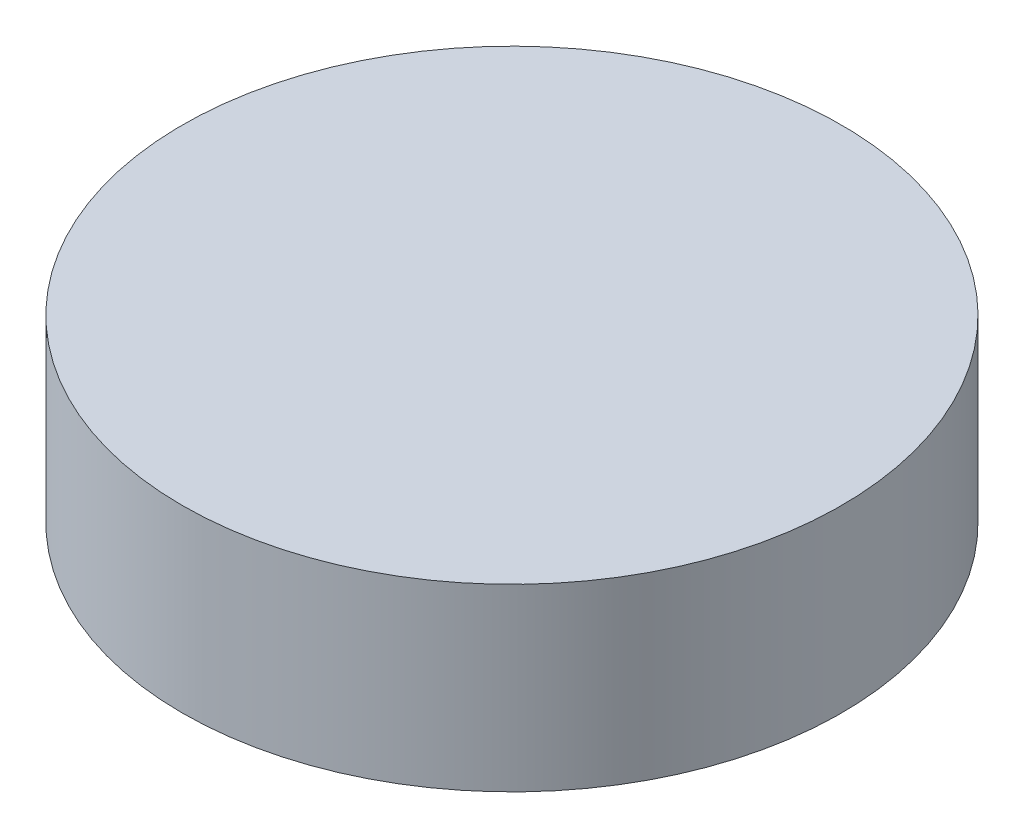
ISO-10303-21;
HEADER;
FILE_DESCRIPTION(('STEP AP214'),'2;1');
FILE_NAME('part.step','',(''),(''),'','','');
FILE_SCHEMA(('AUTOMOTIVE_DESIGN { 1 0 10303 214 1 1 1 1 }'));
ENDSEC;
DATA;
#1=APPLICATION_CONTEXT('core data for automotive mechanical design processes');
#2=APPLICATION_PROTOCOL_DEFINITION('international standard','automotive_design',2000,#1);
#3=PRODUCT_CONTEXT('',#1,'mechanical');
#4=PRODUCT('Part','Part','',(#3));
#5=PRODUCT_RELATED_PRODUCT_CATEGORY('part','',(#4));
#6=PRODUCT_DEFINITION_FORMATION('','',#4);
#7=PRODUCT_DEFINITION_CONTEXT('part definition',#1,'design');
#8=PRODUCT_DEFINITION('design','',#6,#7);
#9=PRODUCT_DEFINITION_SHAPE('','',#8);
#10=(LENGTH_UNIT() NAMED_UNIT(*) SI_UNIT(.MILLI.,.METRE.));
#11=(NAMED_UNIT(*) PLANE_ANGLE_UNIT() SI_UNIT($,.RADIAN.));
#12=(NAMED_UNIT(*) SI_UNIT($,.STERADIAN.) SOLID_ANGLE_UNIT());
#13=UNCERTAINTY_MEASURE_WITH_UNIT(LENGTH_MEASURE(1.E-05),#10,'distance_accuracy_value','');
#14=(GEOMETRIC_REPRESENTATION_CONTEXT(3) GLOBAL_UNCERTAINTY_ASSIGNED_CONTEXT((#13)) GLOBAL_UNIT_ASSIGNED_CONTEXT((#10,
#11,#12)) REPRESENTATION_CONTEXT('',''));
#15=CARTESIAN_POINT('',(0.,0.,0.));
#16=DIRECTION('',(0.,0.,1.));
#17=DIRECTION('',(1.,0.,0.));
#18=AXIS2_PLACEMENT_3D('',#15,#16,#17);
#19=CARTESIAN_POINT('',(0.,15.,0.));
#20=DIRECTION('',(0.,-1.,0.));
#21=DIRECTION('',(0.,0.,-1.));
#22=AXIS2_PLACEMENT_3D('',#19,#20,#21);
#23=CYLINDRICAL_SURFACE('',#22,27.5);
#24=CARTESIAN_POINT('',(0.,15.,0.));
#25=DIRECTION('',(0.,1.,0.));
#26=DIRECTION('',(0.,0.,1.));
#27=AXIS2_PLACEMENT_3D('',#24,#25,#26);
#28=CIRCLE('',#27,27.5);
#29=CARTESIAN_POINT('',(0.,15.,27.5));
#30=VERTEX_POINT('',#29);
#31=EDGE_CURVE('E10',#30,#30,#28,.T.);
#32=ORIENTED_EDGE('',*,*,#31,.F.);
#33=EDGE_LOOP('',(#32));
#34=FACE_BOUND('',#33,.T.);
#35=CARTESIAN_POINT('',(0.,0.,0.));
#36=DIRECTION('',(0.,1.,0.));
#37=DIRECTION('',(0.,0.,1.));
#38=AXIS2_PLACEMENT_3D('',#35,#36,#37);
#39=CIRCLE('',#38,27.5);
#40=CARTESIAN_POINT('',(0.,0.,27.5));
#41=VERTEX_POINT('',#40);
#42=EDGE_CURVE('E46',#41,#41,#39,.T.);
#43=ORIENTED_EDGE('',*,*,#42,.T.);
#44=EDGE_LOOP('',(#43));
#45=FACE_BOUND('',#44,.T.);
#46=ADVANCED_FACE('F43',(#34,#45),#23,.T.);
#47=CARTESIAN_POINT('',(0.,15.,0.));
#48=DIRECTION('',(0.,1.,0.));
#49=DIRECTION('',(0.,0.,1.));
#50=AXIS2_PLACEMENT_3D('',#47,#48,#49);
#51=PLANE('',#50);
#52=ORIENTED_EDGE('',*,*,#31,.T.);
#53=EDGE_LOOP('',(#52));
#54=FACE_BOUND('',#53,.T.);
#55=ADVANCED_FACE('F60',(#54),#51,.T.);
#56=CARTESIAN_POINT('',(0.,0.,0.));
#57=DIRECTION('',(0.,1.,0.));
#58=DIRECTION('',(0.,0.,1.));
#59=AXIS2_PLACEMENT_3D('',#56,#57,#58);
#60=PLANE('',#59);
#61=ORIENTED_EDGE('',*,*,#42,.F.);
#62=EDGE_LOOP('',(#61));
#63=FACE_BOUND('',#62,.T.);
#64=ADVANCED_FACE('F58',(#63),#60,.F.);
#65=CLOSED_SHELL('',(#46,#55,#64));
#66=MANIFOLD_SOLID_BREP('B2',#65);
#67=ADVANCED_BREP_SHAPE_REPRESENTATION('',(#18,#66),#14);
#68=SHAPE_DEFINITION_REPRESENTATION(#9,#67);
ENDSEC;
END-ISO-10303-21;
